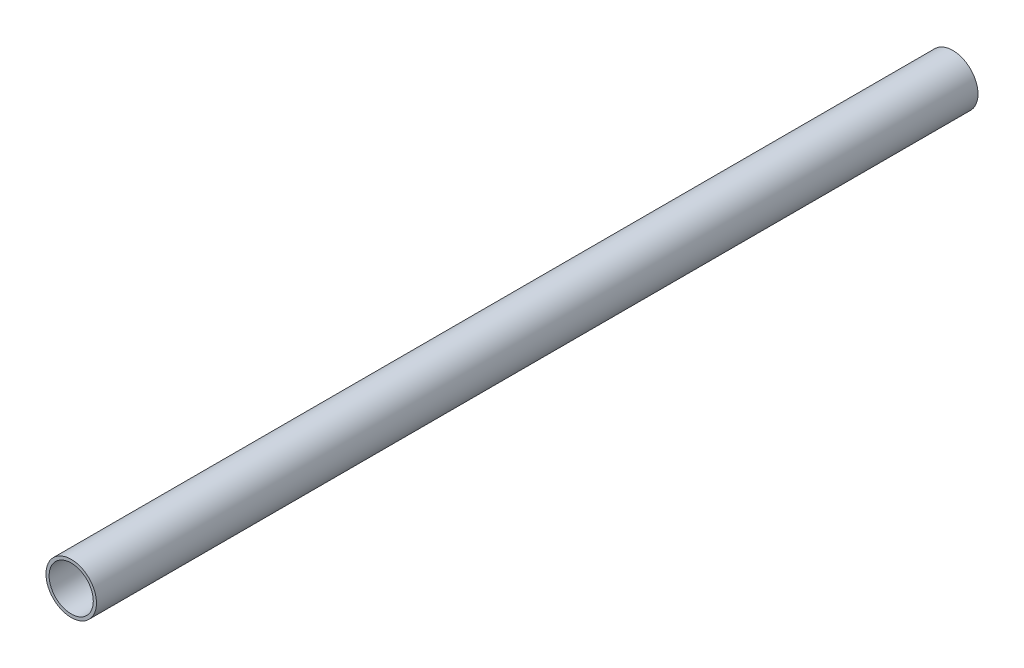
ISO-10303-21;
HEADER;
FILE_DESCRIPTION(('STEP AP214'),'2;1');
FILE_NAME('part.step','',(''),(''),'','','');
FILE_SCHEMA(('AUTOMOTIVE_DESIGN { 1 0 10303 214 1 1 1 1 }'));
ENDSEC;
DATA;
#1=APPLICATION_CONTEXT('core data for automotive mechanical design processes');
#2=APPLICATION_PROTOCOL_DEFINITION('international standard','automotive_design',2000,#1);
#3=PRODUCT_CONTEXT('',#1,'mechanical');
#4=PRODUCT('Part','Part','',(#3));
#5=PRODUCT_RELATED_PRODUCT_CATEGORY('part','',(#4));
#6=PRODUCT_DEFINITION_FORMATION('','',#4);
#7=PRODUCT_DEFINITION_CONTEXT('part definition',#1,'design');
#8=PRODUCT_DEFINITION('design','',#6,#7);
#9=PRODUCT_DEFINITION_SHAPE('','',#8);
#10=(LENGTH_UNIT() NAMED_UNIT(*) SI_UNIT(.MILLI.,.METRE.));
#11=(NAMED_UNIT(*) PLANE_ANGLE_UNIT() SI_UNIT($,.RADIAN.));
#12=(NAMED_UNIT(*) SI_UNIT($,.STERADIAN.) SOLID_ANGLE_UNIT());
#13=UNCERTAINTY_MEASURE_WITH_UNIT(LENGTH_MEASURE(1.E-05),#10,'distance_accuracy_value','');
#14=(GEOMETRIC_REPRESENTATION_CONTEXT(3) GLOBAL_UNCERTAINTY_ASSIGNED_CONTEXT((#13)) GLOBAL_UNIT_ASSIGNED_CONTEXT((#10,
#11,#12)) REPRESENTATION_CONTEXT('',''));
#15=CARTESIAN_POINT('',(0.,0.,0.));
#16=DIRECTION('',(0.,0.,1.));
#17=DIRECTION('',(1.,0.,0.));
#18=AXIS2_PLACEMENT_3D('',#15,#16,#17);
#19=CARTESIAN_POINT('',(0.,0.,139.7));
#20=DIRECTION('',(0.,0.,1.));
#21=DIRECTION('',(1.,0.,0.));
#22=AXIS2_PLACEMENT_3D('',#19,#20,#21);
#23=PLANE('',#22);
#24=CARTESIAN_POINT('',(0.,0.,139.7));
#25=DIRECTION('',(0.,0.,1.));
#26=DIRECTION('',(1.,0.,0.));
#27=AXIS2_PLACEMENT_3D('',#24,#25,#26);
#28=CIRCLE('',#27,8.);
#29=CARTESIAN_POINT('',(8.,0.,139.7));
#30=VERTEX_POINT('',#29);
#31=EDGE_CURVE('E10',#30,#30,#28,.T.);
#32=ORIENTED_EDGE('',*,*,#31,.T.);
#33=EDGE_LOOP('',(#32));
#34=FACE_BOUND('',#33,.T.);
#35=CARTESIAN_POINT('',(0.,0.,139.7));
#36=DIRECTION('',(0.,0.,1.));
#37=DIRECTION('',(1.,0.,0.));
#38=AXIS2_PLACEMENT_3D('',#35,#36,#37);
#39=CIRCLE('',#38,7.);
#40=CARTESIAN_POINT('',(7.,0.,139.7));
#41=VERTEX_POINT('',#40);
#42=EDGE_CURVE('E42',#41,#41,#39,.T.);
#43=ORIENTED_EDGE('',*,*,#42,.F.);
#44=EDGE_LOOP('',(#43));
#45=FACE_BOUND('',#44,.T.);
#46=ADVANCED_FACE('F31',(#34,#45),#23,.T.);
#47=CARTESIAN_POINT('',(0.,0.,-139.7));
#48=DIRECTION('',(0.,0.,1.));
#49=DIRECTION('',(1.,0.,0.));
#50=AXIS2_PLACEMENT_3D('',#47,#48,#49);
#51=PLANE('',#50);
#52=CARTESIAN_POINT('',(0.,0.,-139.7));
#53=DIRECTION('',(0.,0.,1.));
#54=DIRECTION('',(1.,0.,0.));
#55=AXIS2_PLACEMENT_3D('',#52,#53,#54);
#56=CIRCLE('',#55,8.);
#57=CARTESIAN_POINT('',(8.,0.,-139.7));
#58=VERTEX_POINT('',#57);
#59=EDGE_CURVE('E35',#58,#58,#56,.T.);
#60=ORIENTED_EDGE('',*,*,#59,.F.);
#61=EDGE_LOOP('',(#60));
#62=FACE_BOUND('',#61,.T.);
#63=CARTESIAN_POINT('',(0.,0.,-139.7));
#64=DIRECTION('',(0.,0.,1.));
#65=DIRECTION('',(1.,0.,0.));
#66=AXIS2_PLACEMENT_3D('',#63,#64,#65);
#67=CIRCLE('',#66,7.);
#68=CARTESIAN_POINT('',(7.,0.,-139.7));
#69=VERTEX_POINT('',#68);
#70=EDGE_CURVE('E44',#69,#69,#67,.T.);
#71=ORIENTED_EDGE('',*,*,#70,.T.);
#72=EDGE_LOOP('',(#71));
#73=FACE_BOUND('',#72,.T.);
#74=ADVANCED_FACE('F54',(#62,#73),#51,.F.);
#75=CARTESIAN_POINT('',(0.,0.,139.7));
#76=DIRECTION('',(0.,0.,-1.));
#77=DIRECTION('',(-1.,0.,0.));
#78=AXIS2_PLACEMENT_3D('',#75,#76,#77);
#79=CYLINDRICAL_SURFACE('',#78,8.);
#80=ORIENTED_EDGE('',*,*,#31,.F.);
#81=EDGE_LOOP('',(#80));
#82=FACE_BOUND('',#81,.T.);
#83=ORIENTED_EDGE('',*,*,#59,.T.);
#84=EDGE_LOOP('',(#83));
#85=FACE_BOUND('',#84,.T.);
#86=ADVANCED_FACE('F33',(#82,#85),#79,.T.);
#87=CARTESIAN_POINT('',(0.,0.,139.7));
#88=DIRECTION('',(0.,0.,-1.));
#89=DIRECTION('',(-1.,0.,0.));
#90=AXIS2_PLACEMENT_3D('',#87,#88,#89);
#91=CYLINDRICAL_SURFACE('',#90,7.);
#92=ORIENTED_EDGE('',*,*,#42,.T.);
#93=EDGE_LOOP('',(#92));
#94=FACE_BOUND('',#93,.T.);
#95=ORIENTED_EDGE('',*,*,#70,.F.);
#96=EDGE_LOOP('',(#95));
#97=FACE_BOUND('',#96,.T.);
#98=ADVANCED_FACE('F50',(#94,#97),#91,.F.);
#99=CLOSED_SHELL('',(#46,#74,#86,#98));
#100=MANIFOLD_SOLID_BREP('B2',#99);
#101=ADVANCED_BREP_SHAPE_REPRESENTATION('',(#18,#100),#14);
#102=SHAPE_DEFINITION_REPRESENTATION(#9,#101);
ENDSEC;
END-ISO-10303-21;
